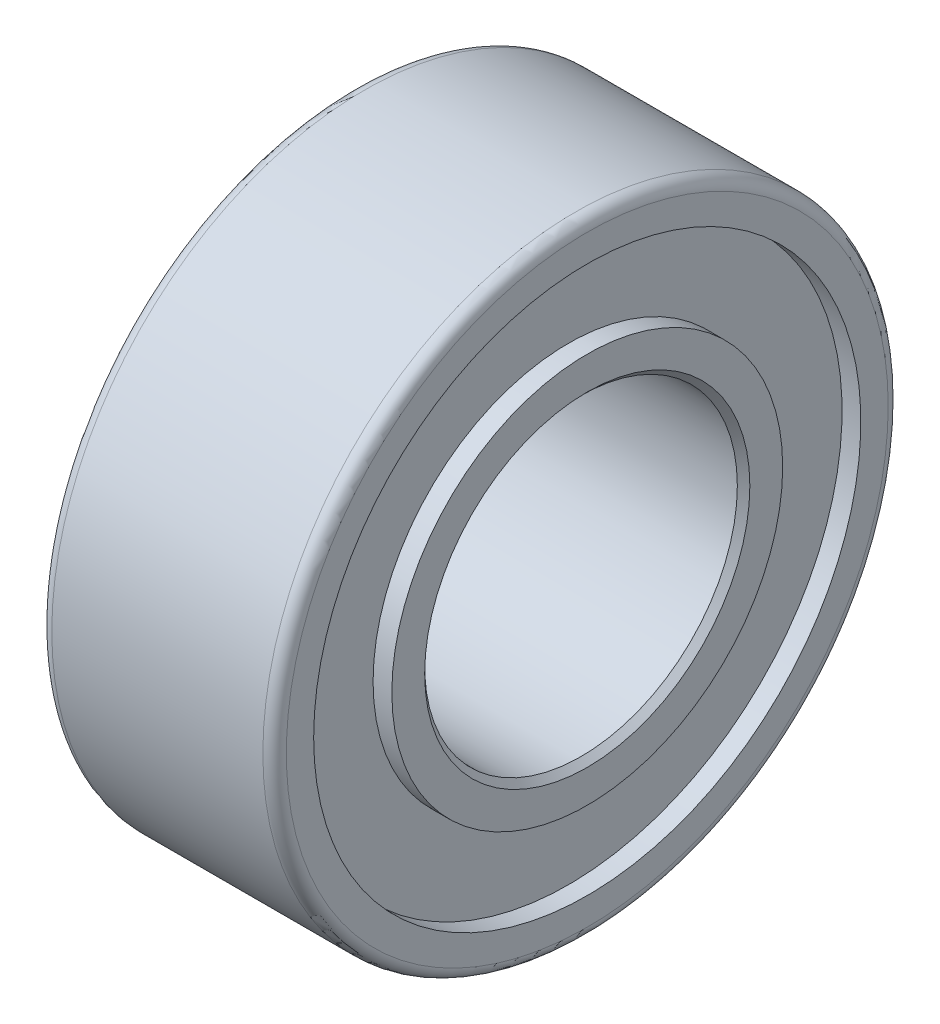
ISO-10303-21;
HEADER;
FILE_DESCRIPTION(('STEP AP214'),'2;1');
FILE_NAME('part.step','',(''),(''),'','','');
FILE_SCHEMA(('AUTOMOTIVE_DESIGN { 1 0 10303 214 1 1 1 1 }'));
ENDSEC;
DATA;
#1=APPLICATION_CONTEXT('core data for automotive mechanical design processes');
#2=APPLICATION_PROTOCOL_DEFINITION('international standard','automotive_design',2000,#1);
#3=PRODUCT_CONTEXT('',#1,'mechanical');
#4=PRODUCT('Part','Part','',(#3));
#5=PRODUCT_RELATED_PRODUCT_CATEGORY('part','',(#4));
#6=PRODUCT_DEFINITION_FORMATION('','',#4);
#7=PRODUCT_DEFINITION_CONTEXT('part definition',#1,'design');
#8=PRODUCT_DEFINITION('design','',#6,#7);
#9=PRODUCT_DEFINITION_SHAPE('','',#8);
#10=(LENGTH_UNIT() NAMED_UNIT(*) SI_UNIT(.MILLI.,.METRE.));
#11=(NAMED_UNIT(*) PLANE_ANGLE_UNIT() SI_UNIT($,.RADIAN.));
#12=(NAMED_UNIT(*) SI_UNIT($,.STERADIAN.) SOLID_ANGLE_UNIT());
#13=UNCERTAINTY_MEASURE_WITH_UNIT(LENGTH_MEASURE(1.E-05),#10,'distance_accuracy_value','');
#14=(GEOMETRIC_REPRESENTATION_CONTEXT(3) GLOBAL_UNCERTAINTY_ASSIGNED_CONTEXT((#13)) GLOBAL_UNIT_ASSIGNED_CONTEXT((#10,
#11,#12)) REPRESENTATION_CONTEXT('',''));
#15=CARTESIAN_POINT('',(0.,0.,0.));
#16=DIRECTION('',(0.,0.,1.));
#17=DIRECTION('',(1.,0.,0.));
#18=AXIS2_PLACEMENT_3D('',#15,#16,#17);
#19=CARTESIAN_POINT('',(2.38125,0.,0.));
#20=DIRECTION('',(1.,0.,0.));
#21=DIRECTION('',(0.,0.,-1.));
#22=AXIS2_PLACEMENT_3D('',#19,#20,#21);
#23=PLANE('',#22);
#24=CARTESIAN_POINT('',(2.38125,0.,0.));
#25=DIRECTION('',(1.,0.,0.));
#26=DIRECTION('',(0.,0.,-1.));
#27=AXIS2_PLACEMENT_3D('',#24,#25,#26);
#28=CIRCLE('',#27,3.30199999999201);
#29=CARTESIAN_POINT('',(2.38125,0.,-3.30199999999201));
#30=VERTEX_POINT('',#29);
#31=EDGE_CURVE('E54',#30,#30,#28,.F.);
#32=ORIENTED_EDGE('',*,*,#31,.T.);
#33=EDGE_LOOP('',(#32));
#34=FACE_BOUND('',#33,.T.);
#35=CARTESIAN_POINT('',(2.38125,0.,0.));
#36=DIRECTION('',(1.,0.,0.));
#37=DIRECTION('',(0.,0.,1.));
#38=AXIS2_PLACEMENT_3D('',#35,#36,#37);
#39=CIRCLE('',#38,3.96875);
#40=CARTESIAN_POINT('',(2.38125,0.,3.96875));
#41=VERTEX_POINT('',#40);
#42=EDGE_CURVE('E82',#41,#41,#39,.T.);
#43=ORIENTED_EDGE('',*,*,#42,.T.);
#44=EDGE_LOOP('',(#43));
#45=FACE_BOUND('',#44,.T.);
#46=ADVANCED_FACE('F31',(#34,#45),#23,.T.);
#47=CARTESIAN_POINT('',(-2.38125,0.,0.));
#48=DIRECTION('',(1.,0.,0.));
#49=DIRECTION('',(0.,0.,-1.));
#50=AXIS2_PLACEMENT_3D('',#47,#48,#49);
#51=PLANE('',#50);
#52=CARTESIAN_POINT('',(-2.38125,0.,0.));
#53=DIRECTION('',(1.,0.,0.));
#54=DIRECTION('',(0.,0.,-1.));
#55=AXIS2_PLACEMENT_3D('',#52,#53,#54);
#56=CIRCLE('',#55,3.30199999999198);
#57=CARTESIAN_POINT('',(-2.38125,0.,-3.30199999999198));
#58=VERTEX_POINT('',#57);
#59=EDGE_CURVE('E51',#58,#58,#56,.T.);
#60=ORIENTED_EDGE('',*,*,#59,.T.);
#61=EDGE_LOOP('',(#60));
#62=FACE_BOUND('',#61,.T.);
#63=CARTESIAN_POINT('',(-2.38125,0.,0.));
#64=DIRECTION('',(-1.,0.,0.));
#65=DIRECTION('',(0.,0.,-1.));
#66=AXIS2_PLACEMENT_3D('',#63,#64,#65);
#67=CIRCLE('',#66,3.96875);
#68=CARTESIAN_POINT('',(-2.38125,0.,-3.96875));
#69=VERTEX_POINT('',#68);
#70=EDGE_CURVE('E70',#69,#69,#67,.T.);
#71=ORIENTED_EDGE('',*,*,#70,.T.);
#72=EDGE_LOOP('',(#71));
#73=FACE_BOUND('',#72,.T.);
#74=ADVANCED_FACE('F116',(#62,#73),#51,.F.);
#75=CARTESIAN_POINT('',(2.38125,0.,0.));
#76=DIRECTION('',(-1.,0.,0.));
#77=DIRECTION('',(0.,0.,1.));
#78=AXIS2_PLACEMENT_3D('',#75,#76,#77);
#79=CYLINDRICAL_SURFACE('',#78,6.35);
#80=CARTESIAN_POINT('',(-2.143125,0.,0.));
#81=DIRECTION('',(1.,0.,0.));
#82=DIRECTION('',(0.,0.,-1.));
#83=AXIS2_PLACEMENT_3D('',#80,#81,#82);
#84=CIRCLE('',#83,6.35);
#85=CARTESIAN_POINT('',(-2.143125,0.,6.35));
#86=VERTEX_POINT('',#85);
#87=EDGE_CURVE('E38',#86,#86,#84,.T.);
#88=CARTESIAN_POINT('',(2.143125,0.,0.));
#89=DIRECTION('',(1.,0.,0.));
#90=DIRECTION('',(0.,0.,-1.));
#91=AXIS2_PLACEMENT_3D('',#88,#89,#90);
#92=CIRCLE('',#91,6.35);
#93=CARTESIAN_POINT('',(2.143125,0.,6.35));
#94=VERTEX_POINT('',#93);
#95=EDGE_CURVE('E42',#94,#94,#92,.F.);
#96=CARTESIAN_POINT('',(-2.143125,0.,6.35));
#97=CARTESIAN_POINT('',(-2.0984765625,0.,6.35));
#98=CARTESIAN_POINT('',(-2.053828125,0.,6.35));
#99=CARTESIAN_POINT('',(-1.96453125,0.,6.35));
#100=CARTESIAN_POINT('',(-1.9198828125,0.,6.35));
#101=CARTESIAN_POINT('',(-1.8305859375,0.,6.35));
#102=CARTESIAN_POINT('',(-1.7859375,0.,6.35));
#103=CARTESIAN_POINT('',(-1.696640625,0.,6.35));
#104=CARTESIAN_POINT('',(-1.6519921875,0.,6.35));
#105=CARTESIAN_POINT('',(-1.5626953125,0.,6.35));
#106=CARTESIAN_POINT('',(-1.518046875,0.,6.35));
#107=CARTESIAN_POINT('',(-1.42875,0.,6.35));
#108=CARTESIAN_POINT('',(-1.3841015625,0.,6.35));
#109=CARTESIAN_POINT('',(-1.2948046875,0.,6.35));
#110=CARTESIAN_POINT('',(-1.25015625,0.,6.35));
#111=CARTESIAN_POINT('',(-1.160859375,0.,6.35));
#112=CARTESIAN_POINT('',(-1.1162109375,0.,6.35));
#113=CARTESIAN_POINT('',(-1.0269140625,0.,6.35));
#114=CARTESIAN_POINT('',(-0.982265624999998,0.,6.35));
#115=CARTESIAN_POINT('',(-0.892968749999998,0.,6.35));
#116=CARTESIAN_POINT('',(-0.848320312499998,0.,6.35));
#117=CARTESIAN_POINT('',(-0.759023437499998,0.,6.35));
#118=CARTESIAN_POINT('',(-0.714374999999998,0.,6.35));
#119=CARTESIAN_POINT('',(-0.625078124999998,0.,6.35));
#120=CARTESIAN_POINT('',(-0.580429687499998,0.,6.35));
#121=CARTESIAN_POINT('',(-0.491132812499998,0.,6.35));
#122=CARTESIAN_POINT('',(-0.446484374999998,0.,6.35));
#123=CARTESIAN_POINT('',(-0.357187499999998,0.,6.35));
#124=CARTESIAN_POINT('',(-0.312539062499998,0.,6.35));
#125=CARTESIAN_POINT('',(-0.223242187499998,0.,6.35));
#126=CARTESIAN_POINT('',(-0.178593749999998,0.,6.35));
#127=CARTESIAN_POINT('',(-0.0892968749999979,0.,6.35));
#128=CARTESIAN_POINT('',(-0.0446484374999979,0.,6.35));
#129=CARTESIAN_POINT('',(0.0446484375000022,0.,6.35));
#130=CARTESIAN_POINT('',(0.0892968750000023,0.,6.35));
#131=CARTESIAN_POINT('',(0.178593750000002,0.,6.35));
#132=CARTESIAN_POINT('',(0.223242187500002,0.,6.35));
#133=CARTESIAN_POINT('',(0.312539062500002,0.,6.35));
#134=CARTESIAN_POINT('',(0.357187500000002,0.,6.35));
#135=CARTESIAN_POINT('',(0.446484375000002,0.,6.35));
#136=CARTESIAN_POINT('',(0.491132812500002,0.,6.35));
#137=CARTESIAN_POINT('',(0.580429687500002,0.,6.35));
#138=CARTESIAN_POINT('',(0.625078125000002,0.,6.35));
#139=CARTESIAN_POINT('',(0.714375000000002,0.,6.35));
#140=CARTESIAN_POINT('',(0.759023437500002,0.,6.35));
#141=CARTESIAN_POINT('',(0.848320312500002,0.,6.35));
#142=CARTESIAN_POINT('',(0.892968750000002,0.,6.35));
#143=CARTESIAN_POINT('',(0.982265625000002,0.,6.35));
#144=CARTESIAN_POINT('',(1.0269140625,0.,6.35));
#145=CARTESIAN_POINT('',(1.1162109375,0.,6.35));
#146=CARTESIAN_POINT('',(1.160859375,0.,6.35));
#147=CARTESIAN_POINT('',(1.25015625,0.,6.35));
#148=CARTESIAN_POINT('',(1.2948046875,0.,6.35));
#149=CARTESIAN_POINT('',(1.3841015625,0.,6.35));
#150=CARTESIAN_POINT('',(1.42875,0.,6.35));
#151=CARTESIAN_POINT('',(1.518046875,0.,6.35));
#152=CARTESIAN_POINT('',(1.5626953125,0.,6.35));
#153=CARTESIAN_POINT('',(1.6519921875,0.,6.35));
#154=CARTESIAN_POINT('',(1.696640625,0.,6.35));
#155=CARTESIAN_POINT('',(1.7859375,0.,6.35));
#156=CARTESIAN_POINT('',(1.8305859375,0.,6.35));
#157=CARTESIAN_POINT('',(1.9198828125,0.,6.35));
#158=CARTESIAN_POINT('',(1.96453125,0.,6.35));
#159=CARTESIAN_POINT('',(2.053828125,0.,6.35));
#160=CARTESIAN_POINT('',(2.0984765625,0.,6.35));
#161=CARTESIAN_POINT('',(2.143125,0.,6.35));
#162=B_SPLINE_CURVE_WITH_KNOTS('',3,(#96,#97,#98,#99,#100,#101,#102,#103,#104,#105,#106,#107,
#108,#109,#110,#111,#112,#113,#114,#115,#116,#117,#118,#119,#120,#121,#122,#123,#124,#125,#126,
#127,#128,#129,#130,#131,#132,#133,#134,#135,#136,#137,#138,#139,#140,#141,#142,#143,#144,#145,
#146,#147,#148,#149,#150,#151,#152,#153,#154,#155,#156,#157,#158,#159,#160,#161),.UNSPECIFIED.,
.F.,.F.,(4,2,2,2,2,2,2,2,2,2,2,2,2,2,2,2,2,2,2,2,2,2,2,2,2,2,2,2,2,2,2,2,4),(0.,0.1339453125,
0.267890625,0.4018359375,0.535781250000001,0.6697265625,0.803671875,0.9376171875,1.0715625,
1.2055078125,1.339453125,1.4733984375,1.60734375,1.7412890625,1.875234375,2.0091796875,2.143125,
2.2770703125,2.411015625,2.5449609375,2.67890625,2.8128515625,2.946796875,3.0807421875,
3.2146875,3.3486328125,3.482578125,3.6165234375,3.75046875,3.8844140625,4.018359375,
4.1523046875,4.28625),.UNSPECIFIED.);
#163=EDGE_CURVE('BSEAM107',#86,#94,#162,.T.);
#164=ORIENTED_EDGE('',*,*,#87,.T.);
#165=ORIENTED_EDGE('',*,*,#95,.T.);
#166=ORIENTED_EDGE('',*,*,#163,.T.);
#167=ORIENTED_EDGE('',*,*,#163,.F.);
#168=EDGE_LOOP('',(#164,#166,#165,#167));
#169=FACE_BOUND('',#168,.T.);
#170=ADVANCED_FACE('F107',(#169),#79,.T.);
#171=CARTESIAN_POINT('',(2.38125,0.,0.));
#172=DIRECTION('',(1.,0.,0.));
#173=DIRECTION('',(0.,0.,-1.));
#174=AXIS2_PLACEMENT_3D('',#171,#172,#173);
#175=CIRCLE('',#174,6.111875);
#176=CARTESIAN_POINT('',(2.38125,0.,-6.111875));
#177=VERTEX_POINT('',#176);
#178=EDGE_CURVE('E10',#177,#177,#175,.T.);
#179=ORIENTED_EDGE('',*,*,#178,.T.);
#180=EDGE_LOOP('',(#179));
#181=FACE_BOUND('',#180,.T.);
#182=CARTESIAN_POINT('',(2.38125,0.,0.));
#183=DIRECTION('',(1.,0.,0.));
#184=DIRECTION('',(0.,0.,1.));
#185=AXIS2_PLACEMENT_3D('',#182,#183,#184);
#186=CIRCLE('',#185,5.55625);
#187=CARTESIAN_POINT('',(2.38125,0.,5.55625));
#188=VERTEX_POINT('',#187);
#189=EDGE_CURVE('E76',#188,#188,#186,.T.);
#190=ORIENTED_EDGE('',*,*,#189,.F.);
#191=EDGE_LOOP('',(#190));
#192=FACE_BOUND('',#191,.T.);
#193=ADVANCED_FACE('F104',(#181,#192),#23,.T.);
#194=CARTESIAN_POINT('',(-2.38125,0.,0.));
#195=DIRECTION('',(1.,0.,0.));
#196=DIRECTION('',(0.,0.,-1.));
#197=AXIS2_PLACEMENT_3D('',#194,#195,#196);
#198=CIRCLE('',#197,6.111875);
#199=CARTESIAN_POINT('',(-2.38125,0.,-6.111875));
#200=VERTEX_POINT('',#199);
#201=EDGE_CURVE('E46',#200,#200,#198,.F.);
#202=ORIENTED_EDGE('',*,*,#201,.T.);
#203=EDGE_LOOP('',(#202));
#204=FACE_BOUND('',#203,.T.);
#205=CARTESIAN_POINT('',(-2.38125,0.,0.));
#206=DIRECTION('',(-1.,0.,0.));
#207=DIRECTION('',(0.,0.,-1.));
#208=AXIS2_PLACEMENT_3D('',#205,#206,#207);
#209=CIRCLE('',#208,5.55625);
#210=CARTESIAN_POINT('',(-2.38125,0.,-5.55625));
#211=VERTEX_POINT('',#210);
#212=EDGE_CURVE('E64',#211,#211,#209,.T.);
#213=ORIENTED_EDGE('',*,*,#212,.F.);
#214=EDGE_LOOP('',(#213));
#215=FACE_BOUND('',#214,.T.);
#216=ADVANCED_FACE('F106',(#204,#215),#51,.F.);
#217=CARTESIAN_POINT('',(-2.38125,0.,0.));
#218=DIRECTION('',(1.,0.,0.));
#219=DIRECTION('',(0.,0.,-1.));
#220=AXIS2_PLACEMENT_3D('',#217,#218,#219);
#221=CYLINDRICAL_SURFACE('',#220,3.175);
#222=CARTESIAN_POINT('',(2.254250000008,0.,0.));
#223=DIRECTION('',(1.,0.,0.));
#224=DIRECTION('',(0.,0.,-1.));
#225=AXIS2_PLACEMENT_3D('',#222,#223,#224);
#226=CIRCLE('',#225,3.175);
#227=CARTESIAN_POINT('',(2.254250000008,0.,-3.175));
#228=VERTEX_POINT('',#227);
#229=EDGE_CURVE('E57',#228,#228,#226,.T.);
#230=CARTESIAN_POINT('',(-2.25425000000801,0.,0.));
#231=DIRECTION('',(1.,0.,0.));
#232=DIRECTION('',(0.,0.,-1.));
#233=AXIS2_PLACEMENT_3D('',#230,#231,#232);
#234=CIRCLE('',#233,3.175);
#235=CARTESIAN_POINT('',(-2.25425000000801,0.,-3.175));
#236=VERTEX_POINT('',#235);
#237=EDGE_CURVE('E60',#236,#236,#234,.F.);
#238=CARTESIAN_POINT('',(2.254250000008,0.,-3.175));
#239=CARTESIAN_POINT('',(2.20728645834116,0.,-3.175));
#240=CARTESIAN_POINT('',(2.16032291667433,0.,-3.175));
#241=CARTESIAN_POINT('',(2.06639583334066,0.,-3.175));
#242=CARTESIAN_POINT('',(2.01943229167383,0.,-3.175));
#243=CARTESIAN_POINT('',(1.92550520834016,0.,-3.175));
#244=CARTESIAN_POINT('',(1.87854166667333,0.,-3.175));
#245=CARTESIAN_POINT('',(1.78461458333966,0.,-3.175));
#246=CARTESIAN_POINT('',(1.73765104167283,0.,-3.175));
#247=CARTESIAN_POINT('',(1.64372395833916,0.,-3.175));
#248=CARTESIAN_POINT('',(1.59676041667233,0.,-3.175));
#249=CARTESIAN_POINT('',(1.50283333333866,0.,-3.175));
#250=CARTESIAN_POINT('',(1.45586979167183,0.,-3.175));
#251=CARTESIAN_POINT('',(1.36194270833816,0.,-3.175));
#252=CARTESIAN_POINT('',(1.31497916667133,0.,-3.175));
#253=CARTESIAN_POINT('',(1.22105208333766,0.,-3.175));
#254=CARTESIAN_POINT('',(1.17408854167083,0.,-3.175));
#255=CARTESIAN_POINT('',(1.08016145833716,0.,-3.175));
#256=CARTESIAN_POINT('',(1.03319791667033,0.,-3.175));
#257=CARTESIAN_POINT('',(0.939270833336662,0.,-3.175));
#258=CARTESIAN_POINT('',(0.892307291669829,0.,-3.175));
#259=CARTESIAN_POINT('',(0.798380208336162,0.,-3.175));
#260=CARTESIAN_POINT('',(0.751416666669329,0.,-3.175));
#261=CARTESIAN_POINT('',(0.657489583335662,0.,-3.175));
#262=CARTESIAN_POINT('',(0.610526041668828,0.,-3.175));
#263=CARTESIAN_POINT('',(0.516598958335161,0.,-3.175));
#264=CARTESIAN_POINT('',(0.469635416668328,0.,-3.175));
#265=CARTESIAN_POINT('',(0.375708333334661,0.,-3.175));
#266=CARTESIAN_POINT('',(0.328744791667828,0.,-3.175));
#267=CARTESIAN_POINT('',(0.234817708334161,0.,-3.175));
#268=CARTESIAN_POINT('',(0.187854166667327,0.,-3.175));
#269=CARTESIAN_POINT('',(0.0939270833336604,0.,-3.175));
#270=CARTESIAN_POINT('',(0.046963541666827,0.,-3.175));
#271=CARTESIAN_POINT('',(-0.04696354166684,0.,-3.175));
#272=CARTESIAN_POINT('',(-0.0939270833336735,0.,-3.175));
#273=CARTESIAN_POINT('',(-0.18785416666734,0.,-3.175));
#274=CARTESIAN_POINT('',(-0.234817708334174,0.,-3.175));
#275=CARTESIAN_POINT('',(-0.328744791667841,0.,-3.175));
#276=CARTESIAN_POINT('',(-0.375708333334674,0.,-3.175));
#277=CARTESIAN_POINT('',(-0.469635416668341,0.,-3.175));
#278=CARTESIAN_POINT('',(-0.516598958335174,0.,-3.175));
#279=CARTESIAN_POINT('',(-0.610526041668841,0.,-3.175));
#280=CARTESIAN_POINT('',(-0.657489583335675,0.,-3.175));
#281=CARTESIAN_POINT('',(-0.751416666669341,0.,-3.175));
#282=CARTESIAN_POINT('',(-0.798380208336175,0.,-3.175));
#283=CARTESIAN_POINT('',(-0.892307291669841,0.,-3.175));
#284=CARTESIAN_POINT('',(-0.939270833336675,0.,-3.175));
#285=CARTESIAN_POINT('',(-1.03319791667034,0.,-3.175));
#286=CARTESIAN_POINT('',(-1.08016145833718,0.,-3.175));
#287=CARTESIAN_POINT('',(-1.17408854167084,0.,-3.175));
#288=CARTESIAN_POINT('',(-1.22105208333768,0.,-3.175));
#289=CARTESIAN_POINT('',(-1.31497916667134,0.,-3.175));
#290=CARTESIAN_POINT('',(-1.36194270833818,0.,-3.175));
#291=CARTESIAN_POINT('',(-1.45586979167184,0.,-3.175));
#292=CARTESIAN_POINT('',(-1.50283333333868,0.,-3.175));
#293=CARTESIAN_POINT('',(-1.59676041667234,0.,-3.175));
#294=CARTESIAN_POINT('',(-1.64372395833918,0.,-3.175));
#295=CARTESIAN_POINT('',(-1.73765104167284,0.,-3.175));
#296=CARTESIAN_POINT('',(-1.78461458333968,0.,-3.175));
#297=CARTESIAN_POINT('',(-1.87854166667334,0.,-3.175));
#298=CARTESIAN_POINT('',(-1.92550520834018,0.,-3.175));
#299=CARTESIAN_POINT('',(-2.01943229167384,0.,-3.175));
#300=CARTESIAN_POINT('',(-2.06639583334068,0.,-3.175));
#301=CARTESIAN_POINT('',(-2.16032291667434,0.,-3.175));
#302=CARTESIAN_POINT('',(-2.20728645834118,0.,-3.175));
#303=CARTESIAN_POINT('',(-2.25425000000801,0.,-3.175));
#304=B_SPLINE_CURVE_WITH_KNOTS('',3,(#238,#239,#240,#241,#242,#243,#244,#245,#246,#247,#248,
#249,#250,#251,#252,#253,#254,#255,#256,#257,#258,#259,#260,#261,#262,#263,#264,#265,#266,#267,
#268,#269,#270,#271,#272,#273,#274,#275,#276,#277,#278,#279,#280,#281,#282,#283,#284,#285,#286,
#287,#288,#289,#290,#291,#292,#293,#294,#295,#296,#297,#298,#299,#300,#301,#302,#303),
.UNSPECIFIED.,.F.,.F.,(4,2,2,2,2,2,2,2,2,2,2,2,2,2,2,2,2,2,2,2,2,2,2,2,2,2,2,2,2,2,2,2,4),(0.,
0.1408906250005,0.281781250001001,0.422671875001501,0.563562500002002,0.704453125002501,
0.845343750003001,0.986234375003502,1.127125000004,1.2680156250045,1.408906250005,
1.5497968750055,1.690687500006,1.8315781250065,1.972468750007,2.1133593750075,2.254250000008,
2.3951406250085,2.53603125000901,2.67692187500951,2.81781250001001,2.95870312501051,
3.09959375001101,3.24048437501151,3.38137500001201,3.52226562501251,3.66315625001301,
3.80404687501351,3.94493750001401,4.08582812501451,4.22671875001501,4.36760937501551,
4.50850000001601),.UNSPECIFIED.);
#305=EDGE_CURVE('BSEAM113',#228,#236,#304,.T.);
#306=ORIENTED_EDGE('',*,*,#229,.T.);
#307=ORIENTED_EDGE('',*,*,#237,.T.);
#308=ORIENTED_EDGE('',*,*,#305,.T.);
#309=ORIENTED_EDGE('',*,*,#305,.F.);
#310=EDGE_LOOP('',(#306,#308,#307,#309));
#311=FACE_BOUND('',#310,.T.);
#312=ADVANCED_FACE('F113',(#311),#221,.F.);
#313=CARTESIAN_POINT('',(-2.00025,0.,0.));
#314=DIRECTION('',(-1.,0.,0.));
#315=DIRECTION('',(0.,0.,1.));
#316=AXIS2_PLACEMENT_3D('',#313,#314,#315);
#317=CYLINDRICAL_SURFACE('',#316,5.55625);
#318=CARTESIAN_POINT('',(-2.00025,0.,0.));
#319=DIRECTION('',(-1.,0.,0.));
#320=DIRECTION('',(0.,0.,-1.));
#321=AXIS2_PLACEMENT_3D('',#318,#319,#320);
#322=CIRCLE('',#321,5.55625);
#323=CARTESIAN_POINT('',(-2.00025,0.,-5.55625));
#324=VERTEX_POINT('',#323);
#325=EDGE_CURVE('E63',#324,#324,#322,.T.);
#326=ORIENTED_EDGE('',*,*,#325,.F.);
#327=EDGE_LOOP('',(#326));
#328=FACE_BOUND('',#327,.T.);
#329=ORIENTED_EDGE('',*,*,#212,.T.);
#330=EDGE_LOOP('',(#329));
#331=FACE_BOUND('',#330,.T.);
#332=ADVANCED_FACE('F144',(#328,#331),#317,.F.);
#333=CARTESIAN_POINT('',(-2.00025,0.,0.));
#334=DIRECTION('',(1.,0.,0.));
#335=DIRECTION('',(0.,0.,-1.));
#336=AXIS2_PLACEMENT_3D('',#333,#334,#335);
#337=PLANE('',#336);
#338=CARTESIAN_POINT('',(-2.00025,0.,0.));
#339=DIRECTION('',(-1.,0.,0.));
#340=DIRECTION('',(0.,0.,-1.));
#341=AXIS2_PLACEMENT_3D('',#338,#339,#340);
#342=CIRCLE('',#341,3.96875);
#343=CARTESIAN_POINT('',(-2.00025,0.,-3.96875));
#344=VERTEX_POINT('',#343);
#345=EDGE_CURVE('E67',#344,#344,#342,.T.);
#346=ORIENTED_EDGE('',*,*,#345,.F.);
#347=EDGE_LOOP('',(#346));
#348=FACE_BOUND('',#347,.T.);
#349=ORIENTED_EDGE('',*,*,#325,.T.);
#350=EDGE_LOOP('',(#349));
#351=FACE_BOUND('',#350,.T.);
#352=ADVANCED_FACE('F140',(#348,#351),#337,.F.);
#353=CARTESIAN_POINT('',(-2.00025,0.,0.));
#354=DIRECTION('',(-1.,0.,0.));
#355=DIRECTION('',(0.,0.,1.));
#356=AXIS2_PLACEMENT_3D('',#353,#354,#355);
#357=CYLINDRICAL_SURFACE('',#356,3.96875);
#358=ORIENTED_EDGE('',*,*,#345,.T.);
#359=EDGE_LOOP('',(#358));
#360=FACE_BOUND('',#359,.T.);
#361=ORIENTED_EDGE('',*,*,#70,.F.);
#362=EDGE_LOOP('',(#361));
#363=FACE_BOUND('',#362,.T.);
#364=ADVANCED_FACE('F100',(#360,#363),#357,.T.);
#365=CARTESIAN_POINT('',(2.00025,0.,0.));
#366=DIRECTION('',(1.,0.,0.));
#367=DIRECTION('',(0.,0.,-1.));
#368=AXIS2_PLACEMENT_3D('',#365,#366,#367);
#369=CYLINDRICAL_SURFACE('',#368,5.55625);
#370=CARTESIAN_POINT('',(2.00025,0.,0.));
#371=DIRECTION('',(1.,0.,0.));
#372=DIRECTION('',(0.,0.,1.));
#373=AXIS2_PLACEMENT_3D('',#370,#371,#372);
#374=CIRCLE('',#373,5.55625);
#375=CARTESIAN_POINT('',(2.00025,0.,5.55625));
#376=VERTEX_POINT('',#375);
#377=EDGE_CURVE('E73',#376,#376,#374,.T.);
#378=ORIENTED_EDGE('',*,*,#377,.F.);
#379=EDGE_LOOP('',(#378));
#380=FACE_BOUND('',#379,.T.);
#381=ORIENTED_EDGE('',*,*,#189,.T.);
#382=EDGE_LOOP('',(#381));
#383=FACE_BOUND('',#382,.T.);
#384=ADVANCED_FACE('F94',(#380,#383),#369,.F.);
#385=CARTESIAN_POINT('',(2.00025,0.,0.));
#386=DIRECTION('',(-1.,0.,0.));
#387=DIRECTION('',(0.,0.,1.));
#388=AXIS2_PLACEMENT_3D('',#385,#386,#387);
#389=PLANE('',#388);
#390=CARTESIAN_POINT('',(2.00025,0.,0.));
#391=DIRECTION('',(1.,0.,0.));
#392=DIRECTION('',(0.,0.,1.));
#393=AXIS2_PLACEMENT_3D('',#390,#391,#392);
#394=CIRCLE('',#393,3.96875);
#395=CARTESIAN_POINT('',(2.00025,0.,3.96875));
#396=VERTEX_POINT('',#395);
#397=EDGE_CURVE('E79',#396,#396,#394,.T.);
#398=ORIENTED_EDGE('',*,*,#397,.F.);
#399=EDGE_LOOP('',(#398));
#400=FACE_BOUND('',#399,.T.);
#401=ORIENTED_EDGE('',*,*,#377,.T.);
#402=EDGE_LOOP('',(#401));
#403=FACE_BOUND('',#402,.T.);
#404=ADVANCED_FACE('F91',(#400,#403),#389,.F.);
#405=CARTESIAN_POINT('',(2.00025,0.,0.));
#406=DIRECTION('',(1.,0.,0.));
#407=DIRECTION('',(0.,0.,-1.));
#408=AXIS2_PLACEMENT_3D('',#405,#406,#407);
#409=CYLINDRICAL_SURFACE('',#408,3.96875);
#410=ORIENTED_EDGE('',*,*,#397,.T.);
#411=EDGE_LOOP('',(#410));
#412=FACE_BOUND('',#411,.T.);
#413=ORIENTED_EDGE('',*,*,#42,.F.);
#414=EDGE_LOOP('',(#413));
#415=FACE_BOUND('',#414,.T.);
#416=ADVANCED_FACE('F88',(#412,#415),#409,.T.);
#417=CARTESIAN_POINT('',(2.254250000008,0.,0.));
#418=DIRECTION('',(1.,0.,0.));
#419=DIRECTION('',(0.,0.,-1.));
#420=AXIS2_PLACEMENT_3D('',#417,#418,#419);
#421=CONICAL_SURFACE('',#420,3.175,0.785398163397453);
#422=ORIENTED_EDGE('',*,*,#31,.F.);
#423=EDGE_LOOP('',(#422));
#424=FACE_BOUND('',#423,.T.);
#425=ORIENTED_EDGE('',*,*,#229,.F.);
#426=EDGE_LOOP('',(#425));
#427=FACE_BOUND('',#426,.T.);
#428=ADVANCED_FACE('F129',(#424,#427),#421,.F.);
#429=CARTESIAN_POINT('',(-2.38125,0.,0.));
#430=DIRECTION('',(-1.,0.,0.));
#431=DIRECTION('',(0.,0.,1.));
#432=AXIS2_PLACEMENT_3D('',#429,#430,#431);
#433=CONICAL_SURFACE('',#432,3.30199999999198,0.785398163397443);
#434=ORIENTED_EDGE('',*,*,#237,.F.);
#435=EDGE_LOOP('',(#434));
#436=FACE_BOUND('',#435,.T.);
#437=ORIENTED_EDGE('',*,*,#59,.F.);
#438=EDGE_LOOP('',(#437));
#439=FACE_BOUND('',#438,.T.);
#440=ADVANCED_FACE('F134',(#436,#439),#433,.F.);
#441=CARTESIAN_POINT('',(-2.143125,0.,0.));
#442=DIRECTION('',(1.,0.,0.));
#443=DIRECTION('',(0.,0.,-1.));
#444=AXIS2_PLACEMENT_3D('',#441,#442,#443);
#445=TOROIDAL_SURFACE('',#444,6.111875,0.238125);
#446=ORIENTED_EDGE('',*,*,#87,.F.);
#447=EDGE_LOOP('',(#446));
#448=FACE_BOUND('',#447,.T.);
#449=ORIENTED_EDGE('',*,*,#201,.F.);
#450=EDGE_LOOP('',(#449));
#451=FACE_BOUND('',#450,.T.);
#452=ADVANCED_FACE('F158',(#448,#451),#445,.T.);
#453=CARTESIAN_POINT('',(2.143125,0.,0.));
#454=DIRECTION('',(1.,0.,0.));
#455=DIRECTION('',(0.,0.,-1.));
#456=AXIS2_PLACEMENT_3D('',#453,#454,#455);
#457=TOROIDAL_SURFACE('',#456,6.111875,0.238125);
#458=ORIENTED_EDGE('',*,*,#178,.F.);
#459=EDGE_LOOP('',(#458));
#460=FACE_BOUND('',#459,.T.);
#461=ORIENTED_EDGE('',*,*,#95,.F.);
#462=EDGE_LOOP('',(#461));
#463=FACE_BOUND('',#462,.T.);
#464=ADVANCED_FACE('F33',(#460,#463),#457,.T.);
#465=CLOSED_SHELL('',(#46,#74,#170,#193,#216,#312,#332,#352,#364,#384,#404,#416,#428,#440,#452,#464));
#466=MANIFOLD_SOLID_BREP('B2',#465);
#467=ADVANCED_BREP_SHAPE_REPRESENTATION('',(#18,#466),#14);
#468=SHAPE_DEFINITION_REPRESENTATION(#9,#467);
ENDSEC;
END-ISO-10303-21;
